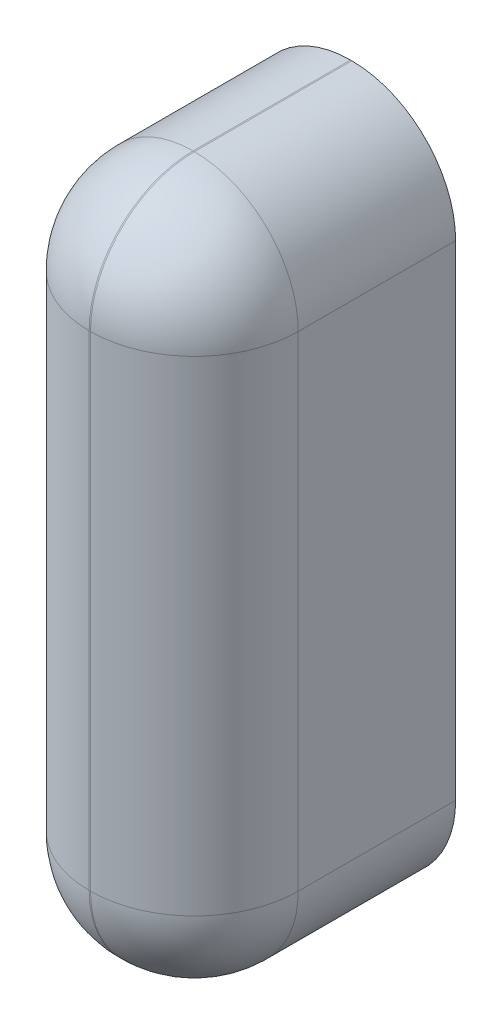
ISO-10303-21;
HEADER;
FILE_DESCRIPTION(('STEP AP214'),'2;1');
FILE_NAME('part.step','',(''),(''),'','','');
FILE_SCHEMA(('AUTOMOTIVE_DESIGN { 1 0 10303 214 1 1 1 1 }'));
ENDSEC;
DATA;
#1=APPLICATION_CONTEXT('core data for automotive mechanical design processes');
#2=APPLICATION_PROTOCOL_DEFINITION('international standard','automotive_design',2000,#1);
#3=PRODUCT_CONTEXT('',#1,'mechanical');
#4=PRODUCT('Part','Part','',(#3));
#5=PRODUCT_RELATED_PRODUCT_CATEGORY('part','',(#4));
#6=PRODUCT_DEFINITION_FORMATION('','',#4);
#7=PRODUCT_DEFINITION_CONTEXT('part definition',#1,'design');
#8=PRODUCT_DEFINITION('design','',#6,#7);
#9=PRODUCT_DEFINITION_SHAPE('','',#8);
#10=(LENGTH_UNIT() NAMED_UNIT(*) SI_UNIT(.MILLI.,.METRE.));
#11=(NAMED_UNIT(*) PLANE_ANGLE_UNIT() SI_UNIT($,.RADIAN.));
#12=(NAMED_UNIT(*) SI_UNIT($,.STERADIAN.) SOLID_ANGLE_UNIT());
#13=UNCERTAINTY_MEASURE_WITH_UNIT(LENGTH_MEASURE(1.E-05),#10,'distance_accuracy_value','');
#14=(GEOMETRIC_REPRESENTATION_CONTEXT(3) GLOBAL_UNCERTAINTY_ASSIGNED_CONTEXT((#13)) GLOBAL_UNIT_ASSIGNED_CONTEXT((#10,
#11,#12)) REPRESENTATION_CONTEXT('',''));
#15=CARTESIAN_POINT('',(0.,0.,0.));
#16=DIRECTION('',(0.,0.,1.));
#17=DIRECTION('',(1.,0.,0.));
#18=AXIS2_PLACEMENT_3D('',#15,#16,#17);
#19=CARTESIAN_POINT('',(0.0100000000000002,-3.71,4.));
#20=DIRECTION('',(0.,0.,-1.));
#21=DIRECTION('',(-1.,0.,0.));
#22=AXIS2_PLACEMENT_3D('',#19,#20,#21);
#23=CYLINDRICAL_SURFACE('',#22,1.59);
#24=DIRECTION('',(0.,0.,-1.));
#25=VECTOR('',#24,1.);
#26=CARTESIAN_POINT('',(1.6,-3.70999999999999,4.));
#27=LINE('',#26,#25);
#28=CARTESIAN_POINT('',(1.6,-3.70999999999999,2.41));
#29=VERTEX_POINT('',#28);
#30=CARTESIAN_POINT('',(1.6,-3.70999999999999,0.));
#31=VERTEX_POINT('',#30);
#32=EDGE_CURVE('E114',#29,#31,#27,.T.);
#33=ORIENTED_EDGE('',*,*,#32,.F.);
#34=CARTESIAN_POINT('',(0.0100000000000002,-3.71,2.41));
#35=DIRECTION('',(0.,0.,-1.));
#36=DIRECTION('',(-1.,0.,0.));
#37=AXIS2_PLACEMENT_3D('',#34,#35,#36);
#38=CIRCLE('',#37,1.59);
#39=CARTESIAN_POINT('',(0.00999999999998918,-5.3,2.41));
#40=VERTEX_POINT('',#39);
#41=EDGE_CURVE('E183',#29,#40,#38,.T.);
#42=ORIENTED_EDGE('',*,*,#41,.T.);
#43=DIRECTION('',(0.,0.,-1.));
#44=VECTOR('',#43,1.);
#45=CARTESIAN_POINT('',(0.00999999999998918,-5.3,4.));
#46=LINE('',#45,#44);
#47=CARTESIAN_POINT('',(0.00999999999998918,-5.3,0.));
#48=VERTEX_POINT('',#47);
#49=EDGE_CURVE('E137',#40,#48,#46,.T.);
#50=ORIENTED_EDGE('',*,*,#49,.T.);
#51=CARTESIAN_POINT('',(0.0100000000000002,-3.71,0.));
#52=DIRECTION('',(0.,0.,1.));
#53=DIRECTION('',(1.,0.,0.));
#54=AXIS2_PLACEMENT_3D('',#51,#52,#53);
#55=CIRCLE('',#54,1.59);
#56=EDGE_CURVE('E131',#48,#31,#55,.T.);
#57=ORIENTED_EDGE('',*,*,#56,.T.);
#58=EDGE_LOOP('',(#33,#42,#50,#57));
#59=FACE_BOUND('',#58,.T.);
#60=ADVANCED_FACE('F35',(#59),#23,.T.);
#61=CARTESIAN_POINT('',(1.6,-3.70999999999999,4.));
#62=DIRECTION('',(-1.,0.,0.));
#63=DIRECTION('',(0.,0.,1.));
#64=AXIS2_PLACEMENT_3D('',#61,#62,#63);
#65=PLANE('',#64);
#66=DIRECTION('',(0.,0.,-1.));
#67=VECTOR('',#66,1.);
#68=CARTESIAN_POINT('',(1.6,3.70999999999999,4.));
#69=LINE('',#68,#67);
#70=CARTESIAN_POINT('',(1.6,3.70999999999999,2.41));
#71=VERTEX_POINT('',#70);
#72=CARTESIAN_POINT('',(1.6,3.70999999999999,0.));
#73=VERTEX_POINT('',#72);
#74=EDGE_CURVE('E125',#71,#73,#69,.T.);
#75=ORIENTED_EDGE('',*,*,#74,.F.);
#76=DIRECTION('',(0.,1.,0.));
#77=VECTOR('',#76,1.);
#78=CARTESIAN_POINT('',(1.6,-3.70999999999999,2.41));
#79=LINE('',#78,#77);
#80=EDGE_CURVE('E120',#71,#29,#79,.F.);
#81=ORIENTED_EDGE('',*,*,#80,.T.);
#82=ORIENTED_EDGE('',*,*,#32,.T.);
#83=DIRECTION('',(0.,1.,0.));
#84=VECTOR('',#83,1.);
#85=CARTESIAN_POINT('',(1.6,-3.70999999999999,0.));
#86=LINE('',#85,#84);
#87=EDGE_CURVE('E117',#31,#73,#86,.T.);
#88=ORIENTED_EDGE('',*,*,#87,.T.);
#89=EDGE_LOOP('',(#75,#81,#82,#88));
#90=FACE_BOUND('',#89,.T.);
#91=ADVANCED_FACE('F116',(#90),#65,.F.);
#92=CARTESIAN_POINT('',(0.0100000000000002,3.71,4.));
#93=DIRECTION('',(0.,0.,-1.));
#94=DIRECTION('',(-1.,0.,0.));
#95=AXIS2_PLACEMENT_3D('',#92,#93,#94);
#96=CYLINDRICAL_SURFACE('',#95,1.59);
#97=DIRECTION('',(0.,0.,-1.));
#98=VECTOR('',#97,1.);
#99=CARTESIAN_POINT('',(0.00999999999998918,5.3,4.));
#100=LINE('',#99,#98);
#101=CARTESIAN_POINT('',(0.00999999999998918,5.3,2.41));
#102=VERTEX_POINT('',#101);
#103=CARTESIAN_POINT('',(0.00999999999998918,5.3,0.));
#104=VERTEX_POINT('',#103);
#105=EDGE_CURVE('E167',#102,#104,#100,.T.);
#106=ORIENTED_EDGE('',*,*,#105,.F.);
#107=CARTESIAN_POINT('',(0.0100000000000002,3.71,2.41));
#108=DIRECTION('',(0.,0.,-1.));
#109=DIRECTION('',(-1.,0.,0.));
#110=AXIS2_PLACEMENT_3D('',#107,#108,#109);
#111=CIRCLE('',#110,1.59);
#112=EDGE_CURVE('E58',#102,#71,#111,.T.);
#113=ORIENTED_EDGE('',*,*,#112,.T.);
#114=ORIENTED_EDGE('',*,*,#74,.T.);
#115=CARTESIAN_POINT('',(0.0100000000000002,3.71,0.));
#116=DIRECTION('',(0.,0.,1.));
#117=DIRECTION('',(-1.,0.,0.));
#118=AXIS2_PLACEMENT_3D('',#115,#116,#117);
#119=CIRCLE('',#118,1.59);
#120=EDGE_CURVE('E134',#73,#104,#119,.T.);
#121=ORIENTED_EDGE('',*,*,#120,.T.);
#122=EDGE_LOOP('',(#106,#113,#114,#121));
#123=FACE_BOUND('',#122,.T.);
#124=ADVANCED_FACE('F262',(#123),#96,.T.);
#125=CARTESIAN_POINT('',(-0.00999999999998832,5.3,4.));
#126=DIRECTION('',(0.,-1.,0.));
#127=DIRECTION('',(0.,0.,-1.));
#128=AXIS2_PLACEMENT_3D('',#125,#126,#127);
#129=PLANE('',#128);
#130=DIRECTION('',(0.,0.,-1.));
#131=VECTOR('',#130,1.);
#132=CARTESIAN_POINT('',(-0.00999999999998833,5.3,4.));
#133=LINE('',#132,#131);
#134=CARTESIAN_POINT('',(-0.00999999999998833,5.3,2.41));
#135=VERTEX_POINT('',#134);
#136=CARTESIAN_POINT('',(-0.00999999999998833,5.3,0.));
#137=VERTEX_POINT('',#136);
#138=EDGE_CURVE('E165',#135,#137,#133,.T.);
#139=ORIENTED_EDGE('',*,*,#138,.F.);
#140=DIRECTION('',(-1.,0.,0.));
#141=VECTOR('',#140,1.);
#142=CARTESIAN_POINT('',(0.00999999999998918,5.3,2.41));
#143=LINE('',#142,#141);
#144=EDGE_CURVE('E178',#135,#102,#143,.F.);
#145=ORIENTED_EDGE('',*,*,#144,.T.);
#146=ORIENTED_EDGE('',*,*,#105,.T.);
#147=DIRECTION('',(-1.,0.,0.));
#148=VECTOR('',#147,1.);
#149=CARTESIAN_POINT('',(-0.00999999999998832,5.3,0.));
#150=LINE('',#149,#148);
#151=EDGE_CURVE('E144',#104,#137,#150,.T.);
#152=ORIENTED_EDGE('',*,*,#151,.T.);
#153=EDGE_LOOP('',(#139,#145,#146,#152));
#154=FACE_BOUND('',#153,.T.);
#155=ADVANCED_FACE('F227',(#154),#129,.F.);
#156=CARTESIAN_POINT('',(-0.00999999999999938,3.71,4.));
#157=DIRECTION('',(0.,0.,-1.));
#158=DIRECTION('',(-1.,0.,0.));
#159=AXIS2_PLACEMENT_3D('',#156,#157,#158);
#160=CYLINDRICAL_SURFACE('',#159,1.59);
#161=DIRECTION('',(0.,0.,-1.));
#162=VECTOR('',#161,1.);
#163=CARTESIAN_POINT('',(-1.6,3.70999999999999,4.));
#164=LINE('',#163,#162);
#165=CARTESIAN_POINT('',(-1.6,3.70999999999999,2.41));
#166=VERTEX_POINT('',#165);
#167=CARTESIAN_POINT('',(-1.6,3.70999999999999,0.));
#168=VERTEX_POINT('',#167);
#169=EDGE_CURVE('E163',#166,#168,#164,.T.);
#170=ORIENTED_EDGE('',*,*,#169,.F.);
#171=CARTESIAN_POINT('',(-0.00999999999999938,3.71,2.41));
#172=DIRECTION('',(0.,0.,-1.));
#173=DIRECTION('',(-1.,0.,0.));
#174=AXIS2_PLACEMENT_3D('',#171,#172,#173);
#175=CIRCLE('',#174,1.59);
#176=EDGE_CURVE('E44',#166,#135,#175,.T.);
#177=ORIENTED_EDGE('',*,*,#176,.T.);
#178=ORIENTED_EDGE('',*,*,#138,.T.);
#179=CARTESIAN_POINT('',(-0.00999999999999938,3.71,0.));
#180=DIRECTION('',(0.,0.,1.));
#181=DIRECTION('',(1.,0.,0.));
#182=AXIS2_PLACEMENT_3D('',#179,#180,#181);
#183=CIRCLE('',#182,1.59);
#184=EDGE_CURVE('E147',#137,#168,#183,.T.);
#185=ORIENTED_EDGE('',*,*,#184,.T.);
#186=EDGE_LOOP('',(#170,#177,#178,#185));
#187=FACE_BOUND('',#186,.T.);
#188=ADVANCED_FACE('F224',(#187),#160,.T.);
#189=CARTESIAN_POINT('',(-1.6,-3.70999999999999,4.));
#190=DIRECTION('',(1.,0.,0.));
#191=DIRECTION('',(0.,0.,-1.));
#192=AXIS2_PLACEMENT_3D('',#189,#190,#191);
#193=PLANE('',#192);
#194=DIRECTION('',(0.,0.,-1.));
#195=VECTOR('',#194,1.);
#196=CARTESIAN_POINT('',(-1.6,-3.70999999999999,4.));
#197=LINE('',#196,#195);
#198=CARTESIAN_POINT('',(-1.6,-3.70999999999999,2.41));
#199=VERTEX_POINT('',#198);
#200=CARTESIAN_POINT('',(-1.6,-3.70999999999999,0.));
#201=VERTEX_POINT('',#200);
#202=EDGE_CURVE('E161',#199,#201,#197,.T.);
#203=ORIENTED_EDGE('',*,*,#202,.F.);
#204=DIRECTION('',(0.,-1.,0.));
#205=VECTOR('',#204,1.);
#206=CARTESIAN_POINT('',(-1.6,3.70999999999999,2.41));
#207=LINE('',#206,#205);
#208=EDGE_CURVE('E11',#199,#166,#207,.F.);
#209=ORIENTED_EDGE('',*,*,#208,.T.);
#210=ORIENTED_EDGE('',*,*,#169,.T.);
#211=DIRECTION('',(0.,-1.,0.));
#212=VECTOR('',#211,1.);
#213=CARTESIAN_POINT('',(-1.6,-3.70999999999999,0.));
#214=LINE('',#213,#212);
#215=EDGE_CURVE('E150',#168,#201,#214,.T.);
#216=ORIENTED_EDGE('',*,*,#215,.T.);
#217=EDGE_LOOP('',(#203,#209,#210,#216));
#218=FACE_BOUND('',#217,.T.);
#219=ADVANCED_FACE('F322',(#218),#193,.F.);
#220=CARTESIAN_POINT('',(-0.00999999999999938,-3.71,4.));
#221=DIRECTION('',(0.,0.,-1.));
#222=DIRECTION('',(-1.,0.,0.));
#223=AXIS2_PLACEMENT_3D('',#220,#221,#222);
#224=CYLINDRICAL_SURFACE('',#223,1.59);
#225=DIRECTION('',(0.,0.,-1.));
#226=VECTOR('',#225,1.);
#227=CARTESIAN_POINT('',(-0.00999999999998832,-5.3,4.));
#228=LINE('',#227,#226);
#229=CARTESIAN_POINT('',(-0.00999999999998832,-5.3,2.41));
#230=VERTEX_POINT('',#229);
#231=CARTESIAN_POINT('',(-0.00999999999998832,-5.3,0.));
#232=VERTEX_POINT('',#231);
#233=EDGE_CURVE('E159',#230,#232,#228,.T.);
#234=ORIENTED_EDGE('',*,*,#233,.F.);
#235=CARTESIAN_POINT('',(-0.00999999999999938,-3.71,2.41));
#236=DIRECTION('',(0.,0.,-1.));
#237=DIRECTION('',(-1.,0.,0.));
#238=AXIS2_PLACEMENT_3D('',#235,#236,#237);
#239=CIRCLE('',#238,1.59);
#240=EDGE_CURVE('E185',#230,#199,#239,.T.);
#241=ORIENTED_EDGE('',*,*,#240,.T.);
#242=ORIENTED_EDGE('',*,*,#202,.T.);
#243=CARTESIAN_POINT('',(-0.00999999999999938,-3.71,0.));
#244=DIRECTION('',(0.,0.,1.));
#245=DIRECTION('',(-1.,0.,0.));
#246=AXIS2_PLACEMENT_3D('',#243,#244,#245);
#247=CIRCLE('',#246,1.59);
#248=EDGE_CURVE('E153',#201,#232,#247,.T.);
#249=ORIENTED_EDGE('',*,*,#248,.T.);
#250=EDGE_LOOP('',(#234,#241,#242,#249));
#251=FACE_BOUND('',#250,.T.);
#252=ADVANCED_FACE('F255',(#251),#224,.T.);
#253=CARTESIAN_POINT('',(-0.00999999999998832,-5.3,4.));
#254=DIRECTION('',(0.,1.,0.));
#255=DIRECTION('',(0.,0.,1.));
#256=AXIS2_PLACEMENT_3D('',#253,#254,#255);
#257=PLANE('',#256);
#258=ORIENTED_EDGE('',*,*,#49,.F.);
#259=DIRECTION('',(1.,0.,0.));
#260=VECTOR('',#259,1.);
#261=CARTESIAN_POINT('',(-0.00999999999998832,-5.3,2.41));
#262=LINE('',#261,#260);
#263=EDGE_CURVE('E181',#40,#230,#262,.F.);
#264=ORIENTED_EDGE('',*,*,#263,.T.);
#265=ORIENTED_EDGE('',*,*,#233,.T.);
#266=DIRECTION('',(1.,0.,0.));
#267=VECTOR('',#266,1.);
#268=CARTESIAN_POINT('',(-0.00999999999998832,-5.3,0.));
#269=LINE('',#268,#267);
#270=EDGE_CURVE('E156',#232,#48,#269,.T.);
#271=ORIENTED_EDGE('',*,*,#270,.T.);
#272=EDGE_LOOP('',(#258,#264,#265,#271));
#273=FACE_BOUND('',#272,.T.);
#274=ADVANCED_FACE('F244',(#273),#257,.F.);
#275=CARTESIAN_POINT('',(0.0100000000000002,-3.71,4.));
#276=DIRECTION('',(0.,0.,1.));
#277=DIRECTION('',(1.,0.,0.));
#278=AXIS2_PLACEMENT_3D('',#275,#276,#277);
#279=PLANE('',#278);
#280=DIRECTION('',(1.,0.,0.));
#281=VECTOR('',#280,1.);
#282=CARTESIAN_POINT('',(0.00999999999998918,-3.71,4.));
#283=LINE('',#282,#281);
#284=CARTESIAN_POINT('',(-0.00999999999999959,-3.71,4.));
#285=VERTEX_POINT('',#284);
#286=CARTESIAN_POINT('',(0.00999999999998918,-3.71,4.));
#287=VERTEX_POINT('',#286);
#288=EDGE_CURVE('E171',#285,#287,#283,.T.);
#289=ORIENTED_EDGE('',*,*,#288,.T.);
#290=DIRECTION('',(0.,1.,0.));
#291=VECTOR('',#290,1.);
#292=CARTESIAN_POINT('',(0.0100000000000005,3.70999999999999,4.));
#293=LINE('',#292,#291);
#294=CARTESIAN_POINT('',(0.00999999999998918,3.71,4.));
#295=VERTEX_POINT('',#294);
#296=EDGE_CURVE('E176',#287,#295,#293,.T.);
#297=ORIENTED_EDGE('',*,*,#296,.T.);
#298=DIRECTION('',(-1.,0.,0.));
#299=VECTOR('',#298,1.);
#300=CARTESIAN_POINT('',(-0.00999999999998833,3.71,4.));
#301=LINE('',#300,#299);
#302=CARTESIAN_POINT('',(-0.00999999999999959,3.71,4.));
#303=VERTEX_POINT('',#302);
#304=EDGE_CURVE('E173',#295,#303,#301,.T.);
#305=ORIENTED_EDGE('',*,*,#304,.T.);
#306=DIRECTION('',(0.,-1.,0.));
#307=VECTOR('',#306,1.);
#308=CARTESIAN_POINT('',(-0.00999999999999959,-3.70999999999999,4.));
#309=LINE('',#308,#307);
#310=EDGE_CURVE('E124',#303,#285,#309,.T.);
#311=ORIENTED_EDGE('',*,*,#310,.T.);
#312=EDGE_LOOP('',(#289,#297,#305,#311));
#313=FACE_BOUND('',#312,.T.);
#314=ADVANCED_FACE('F247',(#313),#279,.T.);
#315=CARTESIAN_POINT('',(0.0100000000000002,-3.71,0.));
#316=DIRECTION('',(0.,0.,1.));
#317=DIRECTION('',(1.,0.,0.));
#318=AXIS2_PLACEMENT_3D('',#315,#316,#317);
#319=PLANE('',#318);
#320=ORIENTED_EDGE('',*,*,#56,.F.);
#321=ORIENTED_EDGE('',*,*,#270,.F.);
#322=ORIENTED_EDGE('',*,*,#248,.F.);
#323=ORIENTED_EDGE('',*,*,#215,.F.);
#324=ORIENTED_EDGE('',*,*,#184,.F.);
#325=ORIENTED_EDGE('',*,*,#151,.F.);
#326=ORIENTED_EDGE('',*,*,#120,.F.);
#327=ORIENTED_EDGE('',*,*,#87,.F.);
#328=EDGE_LOOP('',(#320,#321,#322,#323,#324,#325,#326,#327));
#329=FACE_BOUND('',#328,.T.);
#330=ADVANCED_FACE('F129',(#329),#319,.F.);
#331=CARTESIAN_POINT('',(0.0100000000000002,-3.71,2.41));
#332=DIRECTION('',(-1.,0.,0.));
#333=DIRECTION('',(0.,0.,1.));
#334=AXIS2_PLACEMENT_3D('',#331,#332,#333);
#335=CYLINDRICAL_SURFACE('',#334,1.59);
#336=CARTESIAN_POINT('',(-0.00999999999998832,-3.71,2.41));
#337=DIRECTION('',(-1.,0.,0.));
#338=DIRECTION('',(0.,0.,1.));
#339=AXIS2_PLACEMENT_3D('',#336,#337,#338);
#340=CIRCLE('',#339,1.59);
#341=EDGE_CURVE('E141',#230,#285,#340,.T.);
#342=ORIENTED_EDGE('',*,*,#341,.F.);
#343=ORIENTED_EDGE('',*,*,#263,.F.);
#344=CARTESIAN_POINT('',(0.00999999999998918,-3.71,2.41));
#345=DIRECTION('',(1.,0.,0.));
#346=DIRECTION('',(0.,0.,-1.));
#347=AXIS2_PLACEMENT_3D('',#344,#345,#346);
#348=CIRCLE('',#347,1.59);
#349=EDGE_CURVE('E39',#287,#40,#348,.T.);
#350=ORIENTED_EDGE('',*,*,#349,.F.);
#351=ORIENTED_EDGE('',*,*,#288,.F.);
#352=EDGE_LOOP('',(#342,#343,#350,#351));
#353=FACE_BOUND('',#352,.T.);
#354=ADVANCED_FACE('F37',(#353),#335,.T.);
#355=CARTESIAN_POINT('',(0.0100000000000002,-3.71,2.41));
#356=DIRECTION('',(0.,0.,1.));
#357=DIRECTION('',(1.,0.,0.));
#358=AXIS2_PLACEMENT_3D('',#355,#356,#357);
#359=SPHERICAL_SURFACE('',#358,1.59);
#360=ORIENTED_EDGE('',*,*,#349,.T.);
#361=ORIENTED_EDGE('',*,*,#41,.F.);
#362=CARTESIAN_POINT('',(0.0100000000000002,-3.71,2.41));
#363=DIRECTION('',(0.,1.,0.));
#364=DIRECTION('',(-1.,0.,0.));
#365=AXIS2_PLACEMENT_3D('',#362,#363,#364);
#366=CIRCLE('',#365,1.59);
#367=EDGE_CURVE('E203',#287,#29,#366,.T.);
#368=ORIENTED_EDGE('',*,*,#367,.F.);
#369=EDGE_LOOP('',(#360,#361,#368));
#370=FACE_BOUND('',#369,.T.);
#371=ADVANCED_FACE('F241',(#370),#359,.T.);
#372=CARTESIAN_POINT('',(-0.00999999999999938,-3.71,2.41));
#373=DIRECTION('',(0.,0.,1.));
#374=DIRECTION('',(1.,0.,0.));
#375=AXIS2_PLACEMENT_3D('',#372,#373,#374);
#376=SPHERICAL_SURFACE('',#375,1.59);
#377=ORIENTED_EDGE('',*,*,#240,.F.);
#378=ORIENTED_EDGE('',*,*,#341,.T.);
#379=CARTESIAN_POINT('',(-0.00999999999999959,-3.71,2.41));
#380=DIRECTION('',(0.,1.,0.));
#381=DIRECTION('',(-1.,0.,0.));
#382=AXIS2_PLACEMENT_3D('',#379,#380,#381);
#383=CIRCLE('',#382,1.59);
#384=EDGE_CURVE('E200',#199,#285,#383,.T.);
#385=ORIENTED_EDGE('',*,*,#384,.F.);
#386=EDGE_LOOP('',(#377,#378,#385));
#387=FACE_BOUND('',#386,.T.);
#388=ADVANCED_FACE('F210',(#387),#376,.T.);
#389=CARTESIAN_POINT('',(0.0100000000000005,-3.71,2.41));
#390=DIRECTION('',(0.,-1.,0.));
#391=DIRECTION('',(0.,0.,-1.));
#392=AXIS2_PLACEMENT_3D('',#389,#390,#391);
#393=CYLINDRICAL_SURFACE('',#392,1.59);
#394=ORIENTED_EDGE('',*,*,#367,.T.);
#395=ORIENTED_EDGE('',*,*,#80,.F.);
#396=CARTESIAN_POINT('',(0.0100000000000005,3.70999999999999,2.41));
#397=DIRECTION('',(0.,1.,0.));
#398=DIRECTION('',(0.,0.,1.));
#399=AXIS2_PLACEMENT_3D('',#396,#397,#398);
#400=CIRCLE('',#399,1.59);
#401=EDGE_CURVE('E197',#295,#71,#400,.T.);
#402=ORIENTED_EDGE('',*,*,#401,.F.);
#403=ORIENTED_EDGE('',*,*,#296,.F.);
#404=EDGE_LOOP('',(#394,#395,#402,#403));
#405=FACE_BOUND('',#404,.T.);
#406=ADVANCED_FACE('F238',(#405),#393,.T.);
#407=CARTESIAN_POINT('',(-0.00999999999999959,-3.71,2.41));
#408=DIRECTION('',(0.,1.,0.));
#409=DIRECTION('',(0.,0.,1.));
#410=AXIS2_PLACEMENT_3D('',#407,#408,#409);
#411=CYLINDRICAL_SURFACE('',#410,1.59);
#412=ORIENTED_EDGE('',*,*,#384,.T.);
#413=ORIENTED_EDGE('',*,*,#310,.F.);
#414=CARTESIAN_POINT('',(-0.00999999999999959,3.70999999999999,2.41));
#415=DIRECTION('',(0.,1.,0.));
#416=DIRECTION('',(0.,0.,1.));
#417=AXIS2_PLACEMENT_3D('',#414,#415,#416);
#418=CIRCLE('',#417,1.59);
#419=EDGE_CURVE('E194',#166,#303,#418,.T.);
#420=ORIENTED_EDGE('',*,*,#419,.F.);
#421=ORIENTED_EDGE('',*,*,#208,.F.);
#422=EDGE_LOOP('',(#412,#413,#420,#421));
#423=FACE_BOUND('',#422,.T.);
#424=ADVANCED_FACE('F216',(#423),#411,.T.);
#425=CARTESIAN_POINT('',(0.0100000000000002,3.71,2.41));
#426=DIRECTION('',(0.,0.,1.));
#427=DIRECTION('',(1.,0.,0.));
#428=AXIS2_PLACEMENT_3D('',#425,#426,#427);
#429=SPHERICAL_SURFACE('',#428,1.59);
#430=ORIENTED_EDGE('',*,*,#401,.T.);
#431=ORIENTED_EDGE('',*,*,#112,.F.);
#432=CARTESIAN_POINT('',(0.0100000000000002,3.71,2.41));
#433=DIRECTION('',(-1.,0.,0.));
#434=DIRECTION('',(0.,-1.,0.));
#435=AXIS2_PLACEMENT_3D('',#432,#433,#434);
#436=CIRCLE('',#435,1.59);
#437=EDGE_CURVE('E192',#295,#102,#436,.T.);
#438=ORIENTED_EDGE('',*,*,#437,.F.);
#439=EDGE_LOOP('',(#430,#431,#438));
#440=FACE_BOUND('',#439,.T.);
#441=ADVANCED_FACE('F234',(#440),#429,.T.);
#442=CARTESIAN_POINT('',(-0.00999999999999938,3.71,2.41));
#443=DIRECTION('',(0.,0.,1.));
#444=DIRECTION('',(1.,0.,0.));
#445=AXIS2_PLACEMENT_3D('',#442,#443,#444);
#446=SPHERICAL_SURFACE('',#445,1.59);
#447=ORIENTED_EDGE('',*,*,#176,.F.);
#448=ORIENTED_EDGE('',*,*,#419,.T.);
#449=CARTESIAN_POINT('',(-0.00999999999999938,3.71,2.41));
#450=DIRECTION('',(1.,0.,0.));
#451=DIRECTION('',(0.,1.,0.));
#452=AXIS2_PLACEMENT_3D('',#449,#450,#451);
#453=CIRCLE('',#452,1.59);
#454=EDGE_CURVE('E190',#135,#303,#453,.T.);
#455=ORIENTED_EDGE('',*,*,#454,.F.);
#456=EDGE_LOOP('',(#447,#448,#455));
#457=FACE_BOUND('',#456,.T.);
#458=ADVANCED_FACE('F221',(#457),#446,.T.);
#459=CARTESIAN_POINT('',(0.0100000000000002,3.71,2.41));
#460=DIRECTION('',(1.,0.,0.));
#461=DIRECTION('',(0.,0.,-1.));
#462=AXIS2_PLACEMENT_3D('',#459,#460,#461);
#463=CYLINDRICAL_SURFACE('',#462,1.59);
#464=ORIENTED_EDGE('',*,*,#437,.T.);
#465=ORIENTED_EDGE('',*,*,#144,.F.);
#466=ORIENTED_EDGE('',*,*,#454,.T.);
#467=ORIENTED_EDGE('',*,*,#304,.F.);
#468=EDGE_LOOP('',(#464,#465,#466,#467));
#469=FACE_BOUND('',#468,.T.);
#470=ADVANCED_FACE('F230',(#469),#463,.T.);
#471=CLOSED_SHELL('',(#60,#91,#124,#155,#188,#219,#252,#274,#314,#330,#354,#371,#388,#406,#424,
#441,#458,#470));
#472=MANIFOLD_SOLID_BREP('B2',#471);
#473=ADVANCED_BREP_SHAPE_REPRESENTATION('',(#18,#472),#14);
#474=SHAPE_DEFINITION_REPRESENTATION(#9,#473);
ENDSEC;
END-ISO-10303-21;
